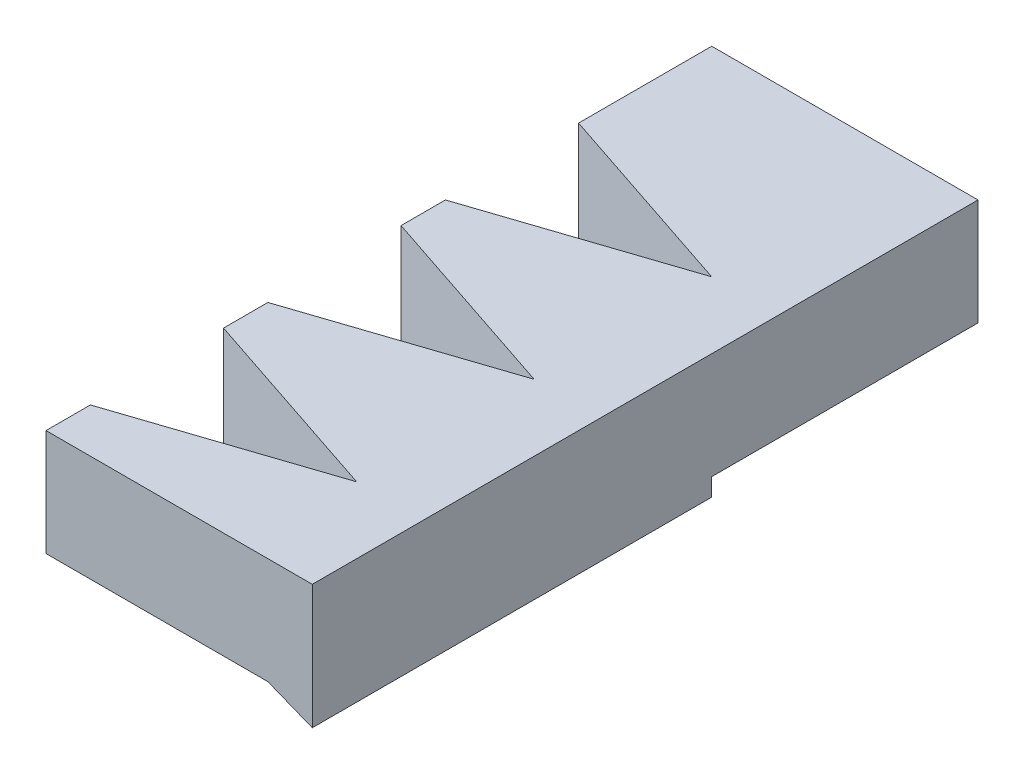
ISO-10303-21;
HEADER;
FILE_DESCRIPTION(('STEP AP214'),'2;1');
FILE_NAME('part.step','',(''),(''),'','','');
FILE_SCHEMA(('AUTOMOTIVE_DESIGN { 1 0 10303 214 1 1 1 1 }'));
ENDSEC;
DATA;
#1=APPLICATION_CONTEXT('core data for automotive mechanical design processes');
#2=APPLICATION_PROTOCOL_DEFINITION('international standard','automotive_design',2000,#1);
#3=PRODUCT_CONTEXT('',#1,'mechanical');
#4=PRODUCT('Part','Part','',(#3));
#5=PRODUCT_RELATED_PRODUCT_CATEGORY('part','',(#4));
#6=PRODUCT_DEFINITION_FORMATION('','',#4);
#7=PRODUCT_DEFINITION_CONTEXT('part definition',#1,'design');
#8=PRODUCT_DEFINITION('design','',#6,#7);
#9=PRODUCT_DEFINITION_SHAPE('','',#8);
#10=(LENGTH_UNIT() NAMED_UNIT(*) SI_UNIT(.MILLI.,.METRE.));
#11=(NAMED_UNIT(*) PLANE_ANGLE_UNIT() SI_UNIT($,.RADIAN.));
#12=(NAMED_UNIT(*) SI_UNIT($,.STERADIAN.) SOLID_ANGLE_UNIT());
#13=UNCERTAINTY_MEASURE_WITH_UNIT(LENGTH_MEASURE(1.E-05),#10,'distance_accuracy_value','');
#14=(GEOMETRIC_REPRESENTATION_CONTEXT(3) GLOBAL_UNCERTAINTY_ASSIGNED_CONTEXT((#13)) GLOBAL_UNIT_ASSIGNED_CONTEXT((#10,
#11,#12)) REPRESENTATION_CONTEXT('',''));
#15=CARTESIAN_POINT('',(0.,0.,0.));
#16=DIRECTION('',(0.,0.,1.));
#17=DIRECTION('',(1.,0.,0.));
#18=AXIS2_PLACEMENT_3D('',#15,#16,#17);
#19=CARTESIAN_POINT('',(0.,12.,0.));
#20=DIRECTION('',(1.,0.,0.));
#21=DIRECTION('',(0.,0.,-1.));
#22=AXIS2_PLACEMENT_3D('',#19,#20,#21);
#23=PLANE('',#22);
#24=DIRECTION('',(0.,-1.,0.));
#25=VECTOR('',#24,1.);
#26=CARTESIAN_POINT('',(0.,39.0416345659799,-40.));
#27=LINE('',#26,#25);
#28=CARTESIAN_POINT('',(0.,12.,-40.));
#29=VERTEX_POINT('',#28);
#30=CARTESIAN_POINT('',(0.,0.,-40.));
#31=VERTEX_POINT('',#30);
#32=EDGE_CURVE('E558',#29,#31,#27,.T.);
#33=ORIENTED_EDGE('',*,*,#32,.F.);
#34=DIRECTION('',(0.,0.,1.));
#35=VECTOR('',#34,1.);
#36=CARTESIAN_POINT('',(0.,12.,0.));
#37=LINE('',#36,#35);
#38=CARTESIAN_POINT('',(0.,12.,-45.));
#39=VERTEX_POINT('',#38);
#40=EDGE_CURVE('E615',#39,#29,#37,.T.);
#41=ORIENTED_EDGE('',*,*,#40,.F.);
#42=DIRECTION('',(0.,-1.,0.));
#43=VECTOR('',#42,1.);
#44=CARTESIAN_POINT('',(0.,39.0416345659799,-45.));
#45=LINE('',#44,#43);
#46=CARTESIAN_POINT('',(0.,0.,-45.));
#47=VERTEX_POINT('',#46);
#48=EDGE_CURVE('E560',#39,#47,#45,.T.);
#49=ORIENTED_EDGE('',*,*,#48,.T.);
#50=DIRECTION('',(0.,0.,1.));
#51=VECTOR('',#50,1.);
#52=CARTESIAN_POINT('',(0.,0.,0.));
#53=LINE('',#52,#51);
#54=EDGE_CURVE('E518',#47,#31,#53,.T.);
#55=ORIENTED_EDGE('',*,*,#54,.T.);
#56=EDGE_LOOP('',(#33,#41,#49,#55));
#57=FACE_BOUND('',#56,.T.);
#58=ADVANCED_FACE('F386',(#57),#23,.F.);
#59=DIRECTION('',(0.,-1.,0.));
#60=VECTOR('',#59,1.);
#61=CARTESIAN_POINT('',(0.,39.0416345659799,-25.));
#62=LINE('',#61,#60);
#63=CARTESIAN_POINT('',(0.,12.,-25.));
#64=VERTEX_POINT('',#63);
#65=CARTESIAN_POINT('',(0.,0.,-25.));
#66=VERTEX_POINT('',#65);
#67=EDGE_CURVE('E579',#64,#66,#62,.T.);
#68=ORIENTED_EDGE('',*,*,#67,.T.);
#69=CARTESIAN_POINT('',(0.,0.,-20.));
#70=VERTEX_POINT('',#69);
#71=EDGE_CURVE('E520',#66,#70,#53,.T.);
#72=ORIENTED_EDGE('',*,*,#71,.T.);
#73=DIRECTION('',(0.,-1.,0.));
#74=VECTOR('',#73,1.);
#75=CARTESIAN_POINT('',(0.,39.0416345659799,-20.));
#76=LINE('',#75,#74);
#77=CARTESIAN_POINT('',(0.,12.,-20.));
#78=VERTEX_POINT('',#77);
#79=EDGE_CURVE('E605',#78,#70,#76,.T.);
#80=ORIENTED_EDGE('',*,*,#79,.F.);
#81=EDGE_CURVE('E616',#64,#78,#37,.T.);
#82=ORIENTED_EDGE('',*,*,#81,.F.);
#83=EDGE_LOOP('',(#68,#72,#80,#82));
#84=FACE_BOUND('',#83,.T.);
#85=ADVANCED_FACE('F640',(#84),#23,.F.);
#86=DIRECTION('',(0.,-1.,0.));
#87=VECTOR('',#86,1.);
#88=CARTESIAN_POINT('',(0.,39.0416345659799,-60.));
#89=LINE('',#88,#87);
#90=CARTESIAN_POINT('',(0.,12.,-60.));
#91=VERTEX_POINT('',#90);
#92=CARTESIAN_POINT('',(0.,0.,-60.));
#93=VERTEX_POINT('',#92);
#94=EDGE_CURVE('E592',#91,#93,#89,.T.);
#95=ORIENTED_EDGE('',*,*,#94,.F.);
#96=CARTESIAN_POINT('',(0.,12.,-75.));
#97=VERTEX_POINT('',#96);
#98=EDGE_CURVE('E540',#97,#91,#37,.T.);
#99=ORIENTED_EDGE('',*,*,#98,.F.);
#100=DIRECTION('',(0.,-1.,0.));
#101=VECTOR('',#100,1.);
#102=CARTESIAN_POINT('',(0.,12.,-75.));
#103=LINE('',#102,#101);
#104=CARTESIAN_POINT('',(0.,0.,-75.));
#105=VERTEX_POINT('',#104);
#106=EDGE_CURVE('E526',#97,#105,#103,.T.);
#107=ORIENTED_EDGE('',*,*,#106,.T.);
#108=EDGE_CURVE('E513',#105,#93,#53,.T.);
#109=ORIENTED_EDGE('',*,*,#108,.T.);
#110=EDGE_LOOP('',(#95,#99,#107,#109));
#111=FACE_BOUND('',#110,.T.);
#112=ADVANCED_FACE('F627',(#111),#23,.F.);
#113=CARTESIAN_POINT('',(0.,12.,0.));
#114=DIRECTION('',(0.,-1.,0.));
#115=DIRECTION('',(0.,0.,-1.));
#116=AXIS2_PLACEMENT_3D('',#113,#114,#115);
#117=PLANE('',#116);
#118=DIRECTION('',(0.948683298050514,0.,0.316227766016838));
#119=VECTOR('',#118,1.);
#120=CARTESIAN_POINT('',(22.5,12.,-32.5));
#121=LINE('',#120,#119);
#122=CARTESIAN_POINT('',(22.5,12.,-32.5));
#123=VERTEX_POINT('',#122);
#124=EDGE_CURVE('E582',#29,#123,#121,.T.);
#125=ORIENTED_EDGE('',*,*,#124,.T.);
#126=DIRECTION('',(-0.948683298050514,0.,0.316227766016838));
#127=VECTOR('',#126,1.);
#128=CARTESIAN_POINT('',(0.,12.,-25.));
#129=LINE('',#128,#127);
#130=EDGE_CURVE('E585',#123,#64,#129,.T.);
#131=ORIENTED_EDGE('',*,*,#130,.T.);
#132=ORIENTED_EDGE('',*,*,#81,.T.);
#133=DIRECTION('',(0.948683298050514,0.,0.316227766016838));
#134=VECTOR('',#133,1.);
#135=CARTESIAN_POINT('',(22.5,12.,-12.5));
#136=LINE('',#135,#134);
#137=CARTESIAN_POINT('',(22.5,12.,-12.5));
#138=VERTEX_POINT('',#137);
#139=EDGE_CURVE('E550',#78,#138,#136,.T.);
#140=ORIENTED_EDGE('',*,*,#139,.T.);
#141=DIRECTION('',(-0.948683298050514,0.,0.316227766016838));
#142=VECTOR('',#141,1.);
#143=CARTESIAN_POINT('',(0.,12.,-5.));
#144=LINE('',#143,#142);
#145=CARTESIAN_POINT('',(0.,12.,-5.));
#146=VERTEX_POINT('',#145);
#147=EDGE_CURVE('E548',#138,#146,#144,.T.);
#148=ORIENTED_EDGE('',*,*,#147,.T.);
#149=CARTESIAN_POINT('',(0.,12.,0.));
#150=VERTEX_POINT('',#149);
#151=EDGE_CURVE('E525',#146,#150,#37,.T.);
#152=ORIENTED_EDGE('',*,*,#151,.T.);
#153=DIRECTION('',(1.,0.,0.));
#154=VECTOR('',#153,1.);
#155=CARTESIAN_POINT('',(0.,12.,0.));
#156=LINE('',#155,#154);
#157=CARTESIAN_POINT('',(30.,12.,0.));
#158=VERTEX_POINT('',#157);
#159=EDGE_CURVE('E538',#150,#158,#156,.T.);
#160=ORIENTED_EDGE('',*,*,#159,.T.);
#161=DIRECTION('',(0.,0.,-1.));
#162=VECTOR('',#161,1.);
#163=CARTESIAN_POINT('',(30.,12.,0.));
#164=LINE('',#163,#162);
#165=CARTESIAN_POINT('',(30.,12.,-75.));
#166=VERTEX_POINT('',#165);
#167=EDGE_CURVE('E537',#158,#166,#164,.T.);
#168=ORIENTED_EDGE('',*,*,#167,.T.);
#169=DIRECTION('',(-1.,0.,0.));
#170=VECTOR('',#169,1.);
#171=CARTESIAN_POINT('',(0.,12.,-75.));
#172=LINE('',#171,#170);
#173=EDGE_CURVE('E530',#166,#97,#172,.T.);
#174=ORIENTED_EDGE('',*,*,#173,.T.);
#175=ORIENTED_EDGE('',*,*,#98,.T.);
#176=DIRECTION('',(0.948683298050514,0.,0.316227766016838));
#177=VECTOR('',#176,1.);
#178=CARTESIAN_POINT('',(22.5,12.,-52.5));
#179=LINE('',#178,#177);
#180=CARTESIAN_POINT('',(22.5,12.,-52.5));
#181=VERTEX_POINT('',#180);
#182=EDGE_CURVE('E588',#91,#181,#179,.T.);
#183=ORIENTED_EDGE('',*,*,#182,.T.);
#184=DIRECTION('',(-0.948683298050514,0.,0.316227766016838));
#185=VECTOR('',#184,1.);
#186=CARTESIAN_POINT('',(0.,12.,-45.));
#187=LINE('',#186,#185);
#188=EDGE_CURVE('E574',#181,#39,#187,.T.);
#189=ORIENTED_EDGE('',*,*,#188,.T.);
#190=ORIENTED_EDGE('',*,*,#40,.T.);
#191=EDGE_LOOP('',(#125,#131,#132,#140,#148,#152,#160,#168,#174,#175,#183,#189,#190));
#192=FACE_BOUND('',#191,.T.);
#193=ADVANCED_FACE('F620',(#192),#117,.F.);
#194=CARTESIAN_POINT('',(0.,0.,0.));
#195=DIRECTION('',(0.,-1.,0.));
#196=DIRECTION('',(0.,0.,-1.));
#197=AXIS2_PLACEMENT_3D('',#194,#195,#196);
#198=PLANE('',#197);
#199=DIRECTION('',(0.,0.,-1.));
#200=VECTOR('',#199,1.);
#201=CARTESIAN_POINT('',(25.,0.,-42.5));
#202=LINE('',#201,#200);
#203=CARTESIAN_POINT('',(25.,0.,0.));
#204=VERTEX_POINT('',#203);
#205=CARTESIAN_POINT('',(25.,0.,-45.));
#206=VERTEX_POINT('',#205);
#207=EDGE_CURVE('E488',#204,#206,#202,.T.);
#208=ORIENTED_EDGE('',*,*,#207,.F.);
#209=DIRECTION('',(1.,0.,0.));
#210=VECTOR('',#209,1.);
#211=CARTESIAN_POINT('',(0.,0.,0.));
#212=LINE('',#211,#210);
#213=CARTESIAN_POINT('',(0.,0.,0.));
#214=VERTEX_POINT('',#213);
#215=EDGE_CURVE('E493',#214,#204,#212,.T.);
#216=ORIENTED_EDGE('',*,*,#215,.F.);
#217=CARTESIAN_POINT('',(0.,0.,-5.));
#218=VERTEX_POINT('',#217);
#219=EDGE_CURVE('E521',#218,#214,#53,.T.);
#220=ORIENTED_EDGE('',*,*,#219,.F.);
#221=DIRECTION('',(0.948683298050514,0.,-0.316227766016838));
#222=VECTOR('',#221,1.);
#223=CARTESIAN_POINT('',(0.,0.,-5.));
#224=LINE('',#223,#222);
#225=CARTESIAN_POINT('',(22.5,0.,-12.5));
#226=VERTEX_POINT('',#225);
#227=EDGE_CURVE('E600',#218,#226,#224,.T.);
#228=ORIENTED_EDGE('',*,*,#227,.T.);
#229=DIRECTION('',(-0.948683298050514,0.,-0.316227766016838));
#230=VECTOR('',#229,1.);
#231=CARTESIAN_POINT('',(22.5,0.,-12.5));
#232=LINE('',#231,#230);
#233=EDGE_CURVE('E602',#226,#70,#232,.T.);
#234=ORIENTED_EDGE('',*,*,#233,.T.);
#235=ORIENTED_EDGE('',*,*,#71,.F.);
#236=DIRECTION('',(0.948683298050514,0.,-0.316227766016838));
#237=VECTOR('',#236,1.);
#238=CARTESIAN_POINT('',(0.,0.,-25.));
#239=LINE('',#238,#237);
#240=CARTESIAN_POINT('',(22.5,0.,-32.5));
#241=VERTEX_POINT('',#240);
#242=EDGE_CURVE('E567',#66,#241,#239,.T.);
#243=ORIENTED_EDGE('',*,*,#242,.T.);
#244=DIRECTION('',(-0.948683298050514,0.,-0.316227766016838));
#245=VECTOR('',#244,1.);
#246=CARTESIAN_POINT('',(22.5,0.,-32.5));
#247=LINE('',#246,#245);
#248=EDGE_CURVE('E565',#241,#31,#247,.T.);
#249=ORIENTED_EDGE('',*,*,#248,.T.);
#250=ORIENTED_EDGE('',*,*,#54,.F.);
#251=DIRECTION('',(0.948683298050514,0.,-0.316227766016838));
#252=VECTOR('',#251,1.);
#253=CARTESIAN_POINT('',(0.,0.,-45.));
#254=LINE('',#253,#252);
#255=CARTESIAN_POINT('',(22.5,0.,-52.5));
#256=VERTEX_POINT('',#255);
#257=EDGE_CURVE('E497',#47,#256,#254,.T.);
#258=ORIENTED_EDGE('',*,*,#257,.T.);
#259=DIRECTION('',(-0.948683298050514,0.,-0.316227766016838));
#260=VECTOR('',#259,1.);
#261=CARTESIAN_POINT('',(22.5,0.,-52.5));
#262=LINE('',#261,#260);
#263=EDGE_CURVE('E590',#256,#93,#262,.T.);
#264=ORIENTED_EDGE('',*,*,#263,.T.);
#265=ORIENTED_EDGE('',*,*,#108,.F.);
#266=DIRECTION('',(-1.,0.,0.));
#267=VECTOR('',#266,1.);
#268=CARTESIAN_POINT('',(0.,0.,-75.));
#269=LINE('',#268,#267);
#270=CARTESIAN_POINT('',(30.,0.,-75.));
#271=VERTEX_POINT('',#270);
#272=EDGE_CURVE('E515',#271,#105,#269,.T.);
#273=ORIENTED_EDGE('',*,*,#272,.F.);
#274=DIRECTION('',(0.,0.,-1.));
#275=VECTOR('',#274,1.);
#276=CARTESIAN_POINT('',(30.,0.,0.));
#277=LINE('',#276,#275);
#278=CARTESIAN_POINT('',(30.,0.,-45.));
#279=VERTEX_POINT('',#278);
#280=EDGE_CURVE('E405',#279,#271,#277,.T.);
#281=ORIENTED_EDGE('',*,*,#280,.F.);
#282=DIRECTION('',(1.,0.,0.));
#283=VECTOR('',#282,1.);
#284=CARTESIAN_POINT('',(27.5,0.,-45.));
#285=LINE('',#284,#283);
#286=EDGE_CURVE('E400',#206,#279,#285,.T.);
#287=ORIENTED_EDGE('',*,*,#286,.F.);
#288=EDGE_LOOP('',(#208,#216,#220,#228,#234,#235,#243,#249,#250,#258,#264,#265,#273,#281,#287));
#289=FACE_BOUND('',#288,.T.);
#290=ADVANCED_FACE('F490',(#289),#198,.T.);
#291=DIRECTION('',(0.,-1.,0.));
#292=VECTOR('',#291,1.);
#293=CARTESIAN_POINT('',(0.,39.0416345659799,-5.));
#294=LINE('',#293,#292);
#295=EDGE_CURVE('E546',#146,#218,#294,.T.);
#296=ORIENTED_EDGE('',*,*,#295,.T.);
#297=ORIENTED_EDGE('',*,*,#219,.T.);
#298=DIRECTION('',(0.,-1.,0.));
#299=VECTOR('',#298,1.);
#300=CARTESIAN_POINT('',(0.,12.,0.));
#301=LINE('',#300,#299);
#302=EDGE_CURVE('E12',#150,#214,#301,.T.);
#303=ORIENTED_EDGE('',*,*,#302,.F.);
#304=ORIENTED_EDGE('',*,*,#151,.F.);
#305=EDGE_LOOP('',(#296,#297,#303,#304));
#306=FACE_BOUND('',#305,.T.);
#307=ADVANCED_FACE('F545',(#306),#23,.F.);
#308=CARTESIAN_POINT('',(0.,12.,0.));
#309=DIRECTION('',(0.,0.,-1.));
#310=DIRECTION('',(-1.,0.,0.));
#311=AXIS2_PLACEMENT_3D('',#308,#309,#310);
#312=PLANE('',#311);
#313=ORIENTED_EDGE('',*,*,#215,.T.);
#314=DIRECTION('',(0.928476690885259,-0.371390676354103,0.));
#315=VECTOR('',#314,1.);
#316=CARTESIAN_POINT('',(27.5,-1.,0.));
#317=LINE('',#316,#315);
#318=CARTESIAN_POINT('',(30.,-2.,0.));
#319=VERTEX_POINT('',#318);
#320=EDGE_CURVE('E502',#204,#319,#317,.T.);
#321=ORIENTED_EDGE('',*,*,#320,.T.);
#322=DIRECTION('',(0.,-1.,0.));
#323=VECTOR('',#322,1.);
#324=CARTESIAN_POINT('',(30.,12.,0.));
#325=LINE('',#324,#323);
#326=EDGE_CURVE('E393',#158,#319,#325,.T.);
#327=ORIENTED_EDGE('',*,*,#326,.F.);
#328=ORIENTED_EDGE('',*,*,#159,.F.);
#329=ORIENTED_EDGE('',*,*,#302,.T.);
#330=EDGE_LOOP('',(#313,#321,#327,#328,#329));
#331=FACE_BOUND('',#330,.T.);
#332=ADVANCED_FACE('F510',(#331),#312,.F.);
#333=CARTESIAN_POINT('',(30.,12.,0.));
#334=DIRECTION('',(-1.,0.,0.));
#335=DIRECTION('',(0.,0.,1.));
#336=AXIS2_PLACEMENT_3D('',#333,#334,#335);
#337=PLANE('',#336);
#338=ORIENTED_EDGE('',*,*,#326,.T.);
#339=DIRECTION('',(0.,0.,-1.));
#340=VECTOR('',#339,1.);
#341=CARTESIAN_POINT('',(30.,-2.,-42.5));
#342=LINE('',#341,#340);
#343=CARTESIAN_POINT('',(30.,-2.,-45.));
#344=VERTEX_POINT('',#343);
#345=EDGE_CURVE('E505',#319,#344,#342,.T.);
#346=ORIENTED_EDGE('',*,*,#345,.T.);
#347=DIRECTION('',(0.,1.,0.));
#348=VECTOR('',#347,1.);
#349=CARTESIAN_POINT('',(30.,-1.,-45.));
#350=LINE('',#349,#348);
#351=EDGE_CURVE('E508',#344,#279,#350,.T.);
#352=ORIENTED_EDGE('',*,*,#351,.T.);
#353=ORIENTED_EDGE('',*,*,#280,.T.);
#354=DIRECTION('',(0.,-1.,0.));
#355=VECTOR('',#354,1.);
#356=CARTESIAN_POINT('',(30.,12.,-75.));
#357=LINE('',#356,#355);
#358=EDGE_CURVE('E529',#166,#271,#357,.T.);
#359=ORIENTED_EDGE('',*,*,#358,.F.);
#360=ORIENTED_EDGE('',*,*,#167,.F.);
#361=EDGE_LOOP('',(#338,#346,#352,#353,#359,#360));
#362=FACE_BOUND('',#361,.T.);
#363=ADVANCED_FACE('F534',(#362),#337,.F.);
#364=CARTESIAN_POINT('',(0.,12.,-75.));
#365=DIRECTION('',(0.,0.,1.));
#366=DIRECTION('',(1.,0.,0.));
#367=AXIS2_PLACEMENT_3D('',#364,#365,#366);
#368=PLANE('',#367);
#369=ORIENTED_EDGE('',*,*,#272,.T.);
#370=ORIENTED_EDGE('',*,*,#106,.F.);
#371=ORIENTED_EDGE('',*,*,#173,.F.);
#372=ORIENTED_EDGE('',*,*,#358,.T.);
#373=EDGE_LOOP('',(#369,#370,#371,#372));
#374=FACE_BOUND('',#373,.T.);
#375=ADVANCED_FACE('F623',(#374),#368,.F.);
#376=CARTESIAN_POINT('',(22.5,39.0416345659799,-12.5));
#377=DIRECTION('',(-0.316227766016838,0.,0.948683298050514));
#378=DIRECTION('',(0.948683298050514,0.,0.316227766016838));
#379=AXIS2_PLACEMENT_3D('',#376,#377,#378);
#380=PLANE('',#379);
#381=ORIENTED_EDGE('',*,*,#79,.T.);
#382=ORIENTED_EDGE('',*,*,#233,.F.);
#383=DIRECTION('',(0.,-1.,0.));
#384=VECTOR('',#383,1.);
#385=CARTESIAN_POINT('',(22.5,39.0416345659799,-12.5));
#386=LINE('',#385,#384);
#387=EDGE_CURVE('E608',#138,#226,#386,.T.);
#388=ORIENTED_EDGE('',*,*,#387,.F.);
#389=ORIENTED_EDGE('',*,*,#139,.F.);
#390=EDGE_LOOP('',(#381,#382,#388,#389));
#391=FACE_BOUND('',#390,.T.);
#392=ADVANCED_FACE('F637',(#391),#380,.T.);
#393=CARTESIAN_POINT('',(0.,39.0416345659799,-5.));
#394=DIRECTION('',(-0.316227766016838,0.,-0.948683298050514));
#395=DIRECTION('',(-0.948683298050514,0.,0.316227766016838));
#396=AXIS2_PLACEMENT_3D('',#393,#394,#395);
#397=PLANE('',#396);
#398=ORIENTED_EDGE('',*,*,#387,.T.);
#399=ORIENTED_EDGE('',*,*,#227,.F.);
#400=ORIENTED_EDGE('',*,*,#295,.F.);
#401=ORIENTED_EDGE('',*,*,#147,.F.);
#402=EDGE_LOOP('',(#398,#399,#400,#401));
#403=FACE_BOUND('',#402,.T.);
#404=ADVANCED_FACE('F635',(#403),#397,.T.);
#405=CARTESIAN_POINT('',(22.5,39.0416345659799,-52.5));
#406=DIRECTION('',(-0.316227766016838,0.,0.948683298050514));
#407=DIRECTION('',(0.948683298050514,0.,0.316227766016838));
#408=AXIS2_PLACEMENT_3D('',#405,#406,#407);
#409=PLANE('',#408);
#410=ORIENTED_EDGE('',*,*,#94,.T.);
#411=ORIENTED_EDGE('',*,*,#263,.F.);
#412=DIRECTION('',(0.,-1.,0.));
#413=VECTOR('',#412,1.);
#414=CARTESIAN_POINT('',(22.5,39.0416345659799,-52.5));
#415=LINE('',#414,#413);
#416=EDGE_CURVE('E594',#181,#256,#415,.T.);
#417=ORIENTED_EDGE('',*,*,#416,.F.);
#418=ORIENTED_EDGE('',*,*,#182,.F.);
#419=EDGE_LOOP('',(#410,#411,#417,#418));
#420=FACE_BOUND('',#419,.T.);
#421=ADVANCED_FACE('F629',(#420),#409,.T.);
#422=CARTESIAN_POINT('',(0.,39.0416345659799,-45.));
#423=DIRECTION('',(-0.316227766016838,0.,-0.948683298050514));
#424=DIRECTION('',(-0.948683298050514,0.,0.316227766016838));
#425=AXIS2_PLACEMENT_3D('',#422,#423,#424);
#426=PLANE('',#425);
#427=ORIENTED_EDGE('',*,*,#416,.T.);
#428=ORIENTED_EDGE('',*,*,#257,.F.);
#429=ORIENTED_EDGE('',*,*,#48,.F.);
#430=ORIENTED_EDGE('',*,*,#188,.F.);
#431=EDGE_LOOP('',(#427,#428,#429,#430));
#432=FACE_BOUND('',#431,.T.);
#433=ADVANCED_FACE('F706',(#432),#426,.T.);
#434=CARTESIAN_POINT('',(22.5,39.0416345659799,-32.5));
#435=DIRECTION('',(-0.316227766016838,0.,0.948683298050514));
#436=DIRECTION('',(0.948683298050514,0.,0.316227766016838));
#437=AXIS2_PLACEMENT_3D('',#434,#435,#436);
#438=PLANE('',#437);
#439=ORIENTED_EDGE('',*,*,#32,.T.);
#440=ORIENTED_EDGE('',*,*,#248,.F.);
#441=DIRECTION('',(0.,-1.,0.));
#442=VECTOR('',#441,1.);
#443=CARTESIAN_POINT('',(22.5,39.0416345659799,-32.5));
#444=LINE('',#443,#442);
#445=EDGE_CURVE('E572',#123,#241,#444,.T.);
#446=ORIENTED_EDGE('',*,*,#445,.F.);
#447=ORIENTED_EDGE('',*,*,#124,.F.);
#448=EDGE_LOOP('',(#439,#440,#446,#447));
#449=FACE_BOUND('',#448,.T.);
#450=ADVANCED_FACE('F713',(#449),#438,.T.);
#451=CARTESIAN_POINT('',(0.,39.0416345659799,-25.));
#452=DIRECTION('',(-0.316227766016838,0.,-0.948683298050514));
#453=DIRECTION('',(-0.948683298050514,0.,0.316227766016838));
#454=AXIS2_PLACEMENT_3D('',#451,#452,#453);
#455=PLANE('',#454);
#456=ORIENTED_EDGE('',*,*,#445,.T.);
#457=ORIENTED_EDGE('',*,*,#242,.F.);
#458=ORIENTED_EDGE('',*,*,#67,.F.);
#459=ORIENTED_EDGE('',*,*,#130,.F.);
#460=EDGE_LOOP('',(#456,#457,#458,#459));
#461=FACE_BOUND('',#460,.T.);
#462=ADVANCED_FACE('F644',(#461),#455,.T.);
#463=CARTESIAN_POINT('',(25.,0.,-40.));
#464=DIRECTION('',(-0.371390676354104,-0.928476690885259,0.));
#465=DIRECTION('',(0.,0.,-1.));
#466=AXIS2_PLACEMENT_3D('',#463,#464,#465);
#467=PLANE('',#466);
#468=ORIENTED_EDGE('',*,*,#207,.T.);
#469=DIRECTION('',(0.928476690885259,-0.371390676354103,0.));
#470=VECTOR('',#469,1.);
#471=CARTESIAN_POINT('',(27.5,-1.,-45.));
#472=LINE('',#471,#470);
#473=EDGE_CURVE('E498',#206,#344,#472,.T.);
#474=ORIENTED_EDGE('',*,*,#473,.T.);
#475=ORIENTED_EDGE('',*,*,#345,.F.);
#476=ORIENTED_EDGE('',*,*,#320,.F.);
#477=EDGE_LOOP('',(#468,#474,#475,#476));
#478=FACE_BOUND('',#477,.T.);
#479=ADVANCED_FACE('F503',(#478),#467,.T.);
#480=CARTESIAN_POINT('',(25.,0.,-45.));
#481=DIRECTION('',(0.,0.,-1.));
#482=DIRECTION('',(1.,0.,0.));
#483=AXIS2_PLACEMENT_3D('',#480,#481,#482);
#484=PLANE('',#483);
#485=ORIENTED_EDGE('',*,*,#286,.T.);
#486=ORIENTED_EDGE('',*,*,#351,.F.);
#487=ORIENTED_EDGE('',*,*,#473,.F.);
#488=EDGE_LOOP('',(#485,#486,#487));
#489=FACE_BOUND('',#488,.T.);
#490=ADVANCED_FACE('F650',(#489),#484,.T.);
#491=CLOSED_SHELL('',(#58,#85,#112,#193,#290,#307,#332,#363,#375,#392,#404,#421,#433,#450,#462,
#479,#490));
#492=MANIFOLD_SOLID_BREP('B2',#491);
#493=ADVANCED_BREP_SHAPE_REPRESENTATION('',(#18,#492),#14);
#494=SHAPE_DEFINITION_REPRESENTATION(#9,#493);
ENDSEC;
END-ISO-10303-21;
